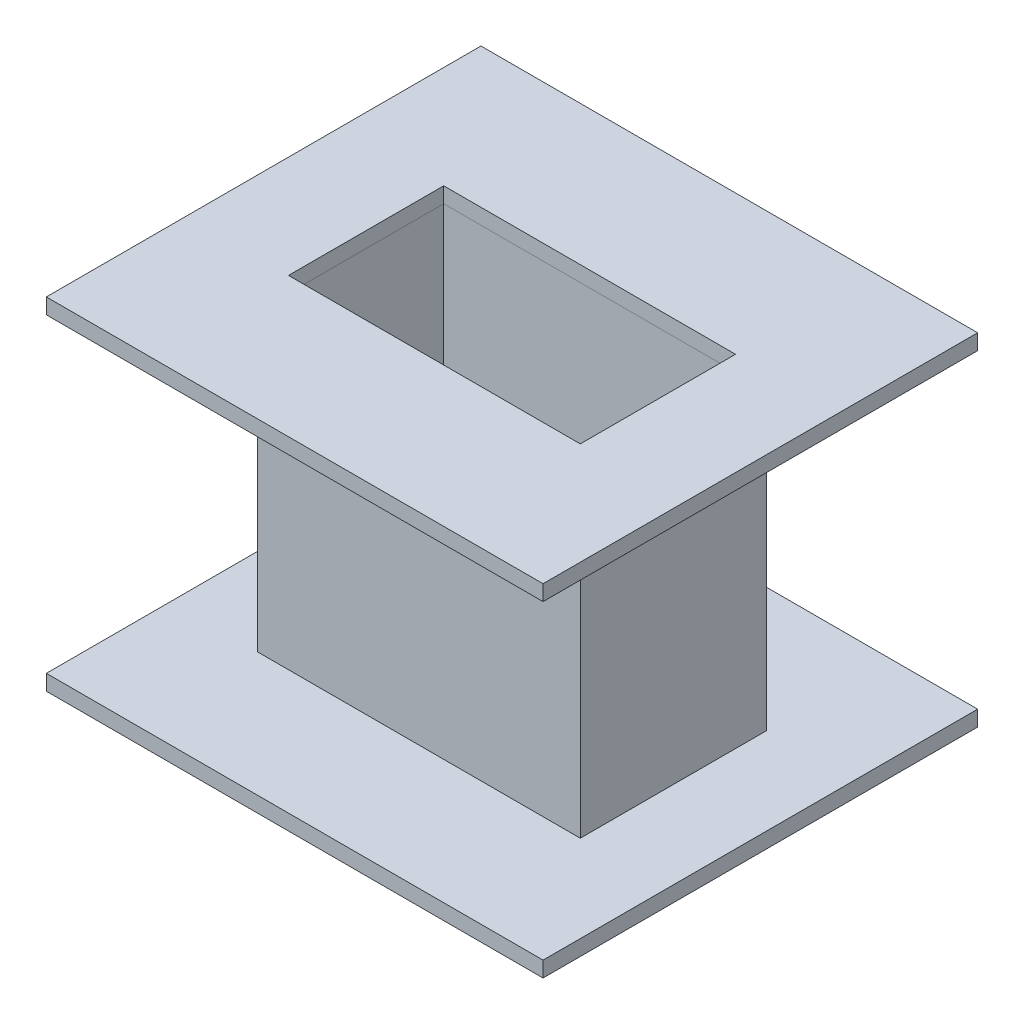
ISO-10303-21;
HEADER;
FILE_DESCRIPTION(('STEP AP214'),'2;1');
FILE_NAME('part.step','',(''),(''),'','','');
FILE_SCHEMA(('AUTOMOTIVE_DESIGN { 1 0 10303 214 1 1 1 1 }'));
ENDSEC;
DATA;
#1=APPLICATION_CONTEXT('core data for automotive mechanical design processes');
#2=APPLICATION_PROTOCOL_DEFINITION('international standard','automotive_design',2000,#1);
#3=PRODUCT_CONTEXT('',#1,'mechanical');
#4=PRODUCT('Part','Part','',(#3));
#5=PRODUCT_RELATED_PRODUCT_CATEGORY('part','',(#4));
#6=PRODUCT_DEFINITION_FORMATION('','',#4);
#7=PRODUCT_DEFINITION_CONTEXT('part definition',#1,'design');
#8=PRODUCT_DEFINITION('design','',#6,#7);
#9=PRODUCT_DEFINITION_SHAPE('','',#8);
#10=(LENGTH_UNIT() NAMED_UNIT(*) SI_UNIT(.MILLI.,.METRE.));
#11=(NAMED_UNIT(*) PLANE_ANGLE_UNIT() SI_UNIT($,.RADIAN.));
#12=(NAMED_UNIT(*) SI_UNIT($,.STERADIAN.) SOLID_ANGLE_UNIT());
#13=UNCERTAINTY_MEASURE_WITH_UNIT(LENGTH_MEASURE(1.E-05),#10,'distance_accuracy_value','');
#14=(GEOMETRIC_REPRESENTATION_CONTEXT(3) GLOBAL_UNCERTAINTY_ASSIGNED_CONTEXT((#13)) GLOBAL_UNIT_ASSIGNED_CONTEXT((#10,
#11,#12)) REPRESENTATION_CONTEXT('',''));
#15=CARTESIAN_POINT('',(0.,0.,0.));
#16=DIRECTION('',(0.,0.,1.));
#17=DIRECTION('',(1.,0.,0.));
#18=AXIS2_PLACEMENT_3D('',#15,#16,#17);
#19=CARTESIAN_POINT('',(40.,27.5,-35.));
#20=DIRECTION('',(-1.,0.,0.));
#21=DIRECTION('',(0.,0.,1.));
#22=AXIS2_PLACEMENT_3D('',#19,#20,#21);
#23=PLANE('',#22);
#24=DIRECTION('',(0.,0.,-1.));
#25=VECTOR('',#24,1.);
#26=CARTESIAN_POINT('',(40.,25.,-35.));
#27=LINE('',#26,#25);
#28=CARTESIAN_POINT('',(40.,25.,35.));
#29=VERTEX_POINT('',#28);
#30=CARTESIAN_POINT('',(40.,25.,-35.));
#31=VERTEX_POINT('',#30);
#32=EDGE_CURVE('E136',#29,#31,#27,.T.);
#33=ORIENTED_EDGE('',*,*,#32,.T.);
#34=DIRECTION('',(0.,-1.,0.));
#35=VECTOR('',#34,1.);
#36=CARTESIAN_POINT('',(40.,27.5,-35.));
#37=LINE('',#36,#35);
#38=CARTESIAN_POINT('',(40.,27.5,-35.));
#39=VERTEX_POINT('',#38);
#40=EDGE_CURVE('E165',#39,#31,#37,.T.);
#41=ORIENTED_EDGE('',*,*,#40,.F.);
#42=DIRECTION('',(0.,0.,-1.));
#43=VECTOR('',#42,1.);
#44=CARTESIAN_POINT('',(40.,27.5,-35.));
#45=LINE('',#44,#43);
#46=CARTESIAN_POINT('',(40.,27.5,35.));
#47=VERTEX_POINT('',#46);
#48=EDGE_CURVE('E139',#47,#39,#45,.T.);
#49=ORIENTED_EDGE('',*,*,#48,.F.);
#50=DIRECTION('',(0.,-1.,0.));
#51=VECTOR('',#50,1.);
#52=CARTESIAN_POINT('',(40.,27.5,35.));
#53=LINE('',#52,#51);
#54=EDGE_CURVE('E149',#47,#29,#53,.T.);
#55=ORIENTED_EDGE('',*,*,#54,.T.);
#56=EDGE_LOOP('',(#33,#41,#49,#55));
#57=FACE_BOUND('',#56,.T.);
#58=ADVANCED_FACE('F46',(#57),#23,.F.);
#59=CARTESIAN_POINT('',(-40.,27.5,-35.));
#60=DIRECTION('',(0.,0.,1.));
#61=DIRECTION('',(1.,0.,0.));
#62=AXIS2_PLACEMENT_3D('',#59,#60,#61);
#63=PLANE('',#62);
#64=DIRECTION('',(-1.,0.,0.));
#65=VECTOR('',#64,1.);
#66=CARTESIAN_POINT('',(-40.,25.,-35.));
#67=LINE('',#66,#65);
#68=CARTESIAN_POINT('',(-40.,25.,-35.));
#69=VERTEX_POINT('',#68);
#70=EDGE_CURVE('E152',#31,#69,#67,.T.);
#71=ORIENTED_EDGE('',*,*,#70,.T.);
#72=DIRECTION('',(0.,-1.,0.));
#73=VECTOR('',#72,1.);
#74=CARTESIAN_POINT('',(-40.,27.5,-35.));
#75=LINE('',#74,#73);
#76=CARTESIAN_POINT('',(-40.,27.5,-35.));
#77=VERTEX_POINT('',#76);
#78=EDGE_CURVE('E162',#77,#69,#75,.T.);
#79=ORIENTED_EDGE('',*,*,#78,.F.);
#80=DIRECTION('',(-1.,0.,0.));
#81=VECTOR('',#80,1.);
#82=CARTESIAN_POINT('',(-40.,27.5,-35.));
#83=LINE('',#82,#81);
#84=EDGE_CURVE('E142',#39,#77,#83,.T.);
#85=ORIENTED_EDGE('',*,*,#84,.F.);
#86=ORIENTED_EDGE('',*,*,#40,.T.);
#87=EDGE_LOOP('',(#71,#79,#85,#86));
#88=FACE_BOUND('',#87,.T.);
#89=ADVANCED_FACE('F189',(#88),#63,.F.);
#90=CARTESIAN_POINT('',(-40.,27.5,-35.));
#91=DIRECTION('',(1.,0.,0.));
#92=DIRECTION('',(0.,0.,-1.));
#93=AXIS2_PLACEMENT_3D('',#90,#91,#92);
#94=PLANE('',#93);
#95=DIRECTION('',(0.,0.,1.));
#96=VECTOR('',#95,1.);
#97=CARTESIAN_POINT('',(-40.,25.,-35.));
#98=LINE('',#97,#96);
#99=CARTESIAN_POINT('',(-40.,25.,35.));
#100=VERTEX_POINT('',#99);
#101=EDGE_CURVE('E154',#69,#100,#98,.T.);
#102=ORIENTED_EDGE('',*,*,#101,.T.);
#103=DIRECTION('',(0.,-1.,0.));
#104=VECTOR('',#103,1.);
#105=CARTESIAN_POINT('',(-40.,27.5,35.));
#106=LINE('',#105,#104);
#107=CARTESIAN_POINT('',(-40.,27.5,35.));
#108=VERTEX_POINT('',#107);
#109=EDGE_CURVE('E159',#108,#100,#106,.T.);
#110=ORIENTED_EDGE('',*,*,#109,.F.);
#111=DIRECTION('',(0.,0.,1.));
#112=VECTOR('',#111,1.);
#113=CARTESIAN_POINT('',(-40.,27.5,-35.));
#114=LINE('',#113,#112);
#115=EDGE_CURVE('E145',#77,#108,#114,.T.);
#116=ORIENTED_EDGE('',*,*,#115,.F.);
#117=ORIENTED_EDGE('',*,*,#78,.T.);
#118=EDGE_LOOP('',(#102,#110,#116,#117));
#119=FACE_BOUND('',#118,.T.);
#120=ADVANCED_FACE('F194',(#119),#94,.F.);
#121=CARTESIAN_POINT('',(-40.,27.5,35.));
#122=DIRECTION('',(0.,0.,-1.));
#123=DIRECTION('',(-1.,0.,0.));
#124=AXIS2_PLACEMENT_3D('',#121,#122,#123);
#125=PLANE('',#124);
#126=DIRECTION('',(1.,0.,0.));
#127=VECTOR('',#126,1.);
#128=CARTESIAN_POINT('',(-40.,25.,35.));
#129=LINE('',#128,#127);
#130=EDGE_CURVE('E143',#100,#29,#129,.T.);
#131=ORIENTED_EDGE('',*,*,#130,.T.);
#132=ORIENTED_EDGE('',*,*,#54,.F.);
#133=DIRECTION('',(1.,0.,0.));
#134=VECTOR('',#133,1.);
#135=CARTESIAN_POINT('',(-40.,27.5,35.));
#136=LINE('',#135,#134);
#137=EDGE_CURVE('E147',#108,#47,#136,.T.);
#138=ORIENTED_EDGE('',*,*,#137,.F.);
#139=ORIENTED_EDGE('',*,*,#109,.T.);
#140=EDGE_LOOP('',(#131,#132,#138,#139));
#141=FACE_BOUND('',#140,.T.);
#142=ADVANCED_FACE('F207',(#141),#125,.F.);
#143=CARTESIAN_POINT('',(0.,27.5,0.));
#144=DIRECTION('',(0.,1.,0.));
#145=DIRECTION('',(0.,0.,1.));
#146=AXIS2_PLACEMENT_3D('',#143,#144,#145);
#147=PLANE('',#146);
#148=DIRECTION('',(0.,0.,1.));
#149=VECTOR('',#148,1.);
#150=CARTESIAN_POINT('',(-23.5,27.5,12.5));
#151=LINE('',#150,#149);
#152=CARTESIAN_POINT('',(-23.5,27.5,-12.5));
#153=VERTEX_POINT('',#152);
#154=CARTESIAN_POINT('',(-23.5,27.5,12.5));
#155=VERTEX_POINT('',#154);
#156=EDGE_CURVE('E60',#153,#155,#151,.T.);
#157=ORIENTED_EDGE('',*,*,#156,.F.);
#158=DIRECTION('',(-1.,0.,0.));
#159=VECTOR('',#158,1.);
#160=CARTESIAN_POINT('',(23.5,27.5,-12.5));
#161=LINE('',#160,#159);
#162=CARTESIAN_POINT('',(23.5,27.5,-12.5));
#163=VERTEX_POINT('',#162);
#164=EDGE_CURVE('E129',#163,#153,#161,.T.);
#165=ORIENTED_EDGE('',*,*,#164,.F.);
#166=DIRECTION('',(0.,0.,-1.));
#167=VECTOR('',#166,1.);
#168=CARTESIAN_POINT('',(23.5,27.5,12.5));
#169=LINE('',#168,#167);
#170=CARTESIAN_POINT('',(23.5,27.5,12.5));
#171=VERTEX_POINT('',#170);
#172=EDGE_CURVE('E113',#171,#163,#169,.T.);
#173=ORIENTED_EDGE('',*,*,#172,.F.);
#174=DIRECTION('',(1.,0.,0.));
#175=VECTOR('',#174,1.);
#176=CARTESIAN_POINT('',(23.5,27.5,12.5));
#177=LINE('',#176,#175);
#178=EDGE_CURVE('E122',#155,#171,#177,.T.);
#179=ORIENTED_EDGE('',*,*,#178,.F.);
#180=EDGE_LOOP('',(#157,#165,#173,#179));
#181=FACE_BOUND('',#180,.T.);
#182=ORIENTED_EDGE('',*,*,#48,.T.);
#183=ORIENTED_EDGE('',*,*,#84,.T.);
#184=ORIENTED_EDGE('',*,*,#115,.T.);
#185=ORIENTED_EDGE('',*,*,#137,.T.);
#186=EDGE_LOOP('',(#182,#183,#184,#185));
#187=FACE_BOUND('',#186,.T.);
#188=ADVANCED_FACE('F126',(#181,#187),#147,.T.);
#189=CARTESIAN_POINT('',(0.,25.,0.));
#190=DIRECTION('',(0.,1.,0.));
#191=DIRECTION('',(0.,0.,1.));
#192=AXIS2_PLACEMENT_3D('',#189,#190,#191);
#193=PLANE('',#192);
#194=DIRECTION('',(-1.,0.,0.));
#195=VECTOR('',#194,1.);
#196=CARTESIAN_POINT('',(0.,25.,-12.5));
#197=LINE('',#196,#195);
#198=CARTESIAN_POINT('',(23.5,25.,-12.5));
#199=VERTEX_POINT('',#198);
#200=CARTESIAN_POINT('',(-23.5,25.,-12.5));
#201=VERTEX_POINT('',#200);
#202=EDGE_CURVE('E53',#199,#201,#197,.T.);
#203=ORIENTED_EDGE('',*,*,#202,.T.);
#204=DIRECTION('',(0.,0.,1.));
#205=VECTOR('',#204,1.);
#206=CARTESIAN_POINT('',(-23.5,25.,0.));
#207=LINE('',#206,#205);
#208=CARTESIAN_POINT('',(-23.5,25.,12.5));
#209=VERTEX_POINT('',#208);
#210=EDGE_CURVE('E12',#201,#209,#207,.T.);
#211=ORIENTED_EDGE('',*,*,#210,.T.);
#212=DIRECTION('',(1.,0.,0.));
#213=VECTOR('',#212,1.);
#214=CARTESIAN_POINT('',(0.,25.,12.5));
#215=LINE('',#214,#213);
#216=CARTESIAN_POINT('',(23.5,25.,12.5));
#217=VERTEX_POINT('',#216);
#218=EDGE_CURVE('E168',#209,#217,#215,.T.);
#219=ORIENTED_EDGE('',*,*,#218,.T.);
#220=DIRECTION('',(0.,0.,-1.));
#221=VECTOR('',#220,1.);
#222=CARTESIAN_POINT('',(23.5,25.,0.));
#223=LINE('',#222,#221);
#224=EDGE_CURVE('E116',#217,#199,#223,.T.);
#225=ORIENTED_EDGE('',*,*,#224,.T.);
#226=EDGE_LOOP('',(#203,#211,#219,#225));
#227=FACE_BOUND('',#226,.T.);
#228=ORIENTED_EDGE('',*,*,#32,.F.);
#229=ORIENTED_EDGE('',*,*,#130,.F.);
#230=ORIENTED_EDGE('',*,*,#101,.F.);
#231=ORIENTED_EDGE('',*,*,#70,.F.);
#232=EDGE_LOOP('',(#228,#229,#230,#231));
#233=FACE_BOUND('',#232,.T.);
#234=ADVANCED_FACE('F172',(#227,#233),#193,.F.);
#235=CARTESIAN_POINT('',(-23.5,-62.5,12.5));
#236=DIRECTION('',(-1.,0.,0.));
#237=DIRECTION('',(0.,0.,1.));
#238=AXIS2_PLACEMENT_3D('',#235,#236,#237);
#239=PLANE('',#238);
#240=DIRECTION('',(0.,1.,0.));
#241=VECTOR('',#240,1.);
#242=CARTESIAN_POINT('',(-23.5,-62.5,-12.5));
#243=LINE('',#242,#241);
#244=EDGE_CURVE('E134',#201,#153,#243,.T.);
#245=ORIENTED_EDGE('',*,*,#244,.T.);
#246=ORIENTED_EDGE('',*,*,#156,.T.);
#247=DIRECTION('',(0.,1.,0.));
#248=VECTOR('',#247,1.);
#249=CARTESIAN_POINT('',(-23.5,-62.5,12.5));
#250=LINE('',#249,#248);
#251=EDGE_CURVE('E119',#209,#155,#250,.T.);
#252=ORIENTED_EDGE('',*,*,#251,.F.);
#253=ORIENTED_EDGE('',*,*,#210,.F.);
#254=EDGE_LOOP('',(#245,#246,#252,#253));
#255=FACE_BOUND('',#254,.T.);
#256=ADVANCED_FACE('F177',(#255),#239,.F.);
#257=CARTESIAN_POINT('',(23.5,-62.5,-12.5));
#258=DIRECTION('',(0.,0.,-1.));
#259=DIRECTION('',(-1.,0.,0.));
#260=AXIS2_PLACEMENT_3D('',#257,#258,#259);
#261=PLANE('',#260);
#262=DIRECTION('',(0.,1.,0.));
#263=VECTOR('',#262,1.);
#264=CARTESIAN_POINT('',(23.5,-62.5,-12.5));
#265=LINE('',#264,#263);
#266=EDGE_CURVE('E118',#199,#163,#265,.T.);
#267=ORIENTED_EDGE('',*,*,#266,.T.);
#268=ORIENTED_EDGE('',*,*,#164,.T.);
#269=ORIENTED_EDGE('',*,*,#244,.F.);
#270=ORIENTED_EDGE('',*,*,#202,.F.);
#271=EDGE_LOOP('',(#267,#268,#269,#270));
#272=FACE_BOUND('',#271,.T.);
#273=ADVANCED_FACE('F176',(#272),#261,.F.);
#274=CARTESIAN_POINT('',(23.5,-62.5,12.5));
#275=DIRECTION('',(1.,0.,0.));
#276=DIRECTION('',(0.,0.,-1.));
#277=AXIS2_PLACEMENT_3D('',#274,#275,#276);
#278=PLANE('',#277);
#279=DIRECTION('',(0.,1.,0.));
#280=VECTOR('',#279,1.);
#281=CARTESIAN_POINT('',(23.5,-62.5,12.5));
#282=LINE('',#281,#280);
#283=EDGE_CURVE('E68',#217,#171,#282,.T.);
#284=ORIENTED_EDGE('',*,*,#283,.T.);
#285=ORIENTED_EDGE('',*,*,#172,.T.);
#286=ORIENTED_EDGE('',*,*,#266,.F.);
#287=ORIENTED_EDGE('',*,*,#224,.F.);
#288=EDGE_LOOP('',(#284,#285,#286,#287));
#289=FACE_BOUND('',#288,.T.);
#290=ADVANCED_FACE('F110',(#289),#278,.F.);
#291=CARTESIAN_POINT('',(23.5,-62.5,12.5));
#292=DIRECTION('',(0.,0.,1.));
#293=DIRECTION('',(1.,0.,0.));
#294=AXIS2_PLACEMENT_3D('',#291,#292,#293);
#295=PLANE('',#294);
#296=ORIENTED_EDGE('',*,*,#251,.T.);
#297=ORIENTED_EDGE('',*,*,#178,.T.);
#298=ORIENTED_EDGE('',*,*,#283,.F.);
#299=ORIENTED_EDGE('',*,*,#218,.F.);
#300=EDGE_LOOP('',(#296,#297,#298,#299));
#301=FACE_BOUND('',#300,.T.);
#302=ADVANCED_FACE('F123',(#301),#295,.F.);
#303=CLOSED_SHELL('',(#58,#89,#120,#142,#188,#234,#256,#273,#290,#302));
#304=MANIFOLD_SOLID_BREP('B2',#303);
#305=CARTESIAN_POINT('',(0.,25.,0.));
#306=DIRECTION('',(0.,-1.,0.));
#307=DIRECTION('',(0.,0.,-1.));
#308=AXIS2_PLACEMENT_3D('',#305,#306,#307);
#309=PLANE('',#308);
#310=DIRECTION('',(-1.,0.,0.));
#311=VECTOR('',#310,1.);
#312=CARTESIAN_POINT('',(-26.,25.,-15.));
#313=LINE('',#312,#311);
#314=CARTESIAN_POINT('',(26.,25.,-15.));
#315=VERTEX_POINT('',#314);
#316=CARTESIAN_POINT('',(-26.,25.,-15.));
#317=VERTEX_POINT('',#316);
#318=EDGE_CURVE('E400',#315,#317,#313,.T.);
#319=ORIENTED_EDGE('',*,*,#318,.T.);
#320=DIRECTION('',(0.,0.,1.));
#321=VECTOR('',#320,1.);
#322=CARTESIAN_POINT('',(-26.,25.,-15.));
#323=LINE('',#322,#321);
#324=CARTESIAN_POINT('',(-26.,25.,15.));
#325=VERTEX_POINT('',#324);
#326=EDGE_CURVE('E414',#317,#325,#323,.T.);
#327=ORIENTED_EDGE('',*,*,#326,.T.);
#328=DIRECTION('',(1.,0.,0.));
#329=VECTOR('',#328,1.);
#330=CARTESIAN_POINT('',(-26.,25.,15.));
#331=LINE('',#330,#329);
#332=CARTESIAN_POINT('',(26.,25.,15.));
#333=VERTEX_POINT('',#332);
#334=EDGE_CURVE('E412',#325,#333,#331,.T.);
#335=ORIENTED_EDGE('',*,*,#334,.T.);
#336=DIRECTION('',(0.,0.,-1.));
#337=VECTOR('',#336,1.);
#338=CARTESIAN_POINT('',(26.,25.,-15.));
#339=LINE('',#338,#337);
#340=EDGE_CURVE('E396',#333,#315,#339,.T.);
#341=ORIENTED_EDGE('',*,*,#340,.T.);
#342=EDGE_LOOP('',(#319,#327,#335,#341));
#343=FACE_BOUND('',#342,.T.);
#344=DIRECTION('',(0.,0.,-1.));
#345=VECTOR('',#344,1.);
#346=CARTESIAN_POINT('',(23.5,25.,-12.5));
#347=LINE('',#346,#345);
#348=CARTESIAN_POINT('',(23.5,25.,12.5));
#349=VERTEX_POINT('',#348);
#350=CARTESIAN_POINT('',(23.5,25.,-12.5));
#351=VERTEX_POINT('',#350);
#352=EDGE_CURVE('E426',#349,#351,#347,.T.);
#353=ORIENTED_EDGE('',*,*,#352,.F.);
#354=DIRECTION('',(1.,0.,0.));
#355=VECTOR('',#354,1.);
#356=CARTESIAN_POINT('',(-23.5,25.,12.5));
#357=LINE('',#356,#355);
#358=CARTESIAN_POINT('',(-23.5,25.,12.5));
#359=VERTEX_POINT('',#358);
#360=EDGE_CURVE('E421',#359,#349,#357,.T.);
#361=ORIENTED_EDGE('',*,*,#360,.F.);
#362=DIRECTION('',(0.,0.,1.));
#363=VECTOR('',#362,1.);
#364=CARTESIAN_POINT('',(-23.5,25.,-12.5));
#365=LINE('',#364,#363);
#366=CARTESIAN_POINT('',(-23.5,25.,-12.5));
#367=VERTEX_POINT('',#366);
#368=EDGE_CURVE('E366',#367,#359,#365,.T.);
#369=ORIENTED_EDGE('',*,*,#368,.F.);
#370=DIRECTION('',(-1.,0.,0.));
#371=VECTOR('',#370,1.);
#372=CARTESIAN_POINT('',(-23.5,25.,-12.5));
#373=LINE('',#372,#371);
#374=EDGE_CURVE('E424',#351,#367,#373,.T.);
#375=ORIENTED_EDGE('',*,*,#374,.F.);
#376=EDGE_LOOP('',(#353,#361,#369,#375));
#377=FACE_BOUND('',#376,.T.);
#378=ADVANCED_FACE('F275',(#343,#377),#309,.F.);
#379=CARTESIAN_POINT('',(-26.,25.,-15.));
#380=DIRECTION('',(0.,0.,1.));
#381=DIRECTION('',(1.,0.,0.));
#382=AXIS2_PLACEMENT_3D('',#379,#380,#381);
#383=PLANE('',#382);
#384=DIRECTION('',(-1.,0.,0.));
#385=VECTOR('',#384,1.);
#386=CARTESIAN_POINT('',(-26.,-25.,-15.));
#387=LINE('',#386,#385);
#388=CARTESIAN_POINT('',(26.,-25.,-15.));
#389=VERTEX_POINT('',#388);
#390=CARTESIAN_POINT('',(-26.,-25.,-15.));
#391=VERTEX_POINT('',#390);
#392=EDGE_CURVE('E407',#389,#391,#387,.T.);
#393=ORIENTED_EDGE('',*,*,#392,.T.);
#394=DIRECTION('',(0.,-1.,0.));
#395=VECTOR('',#394,1.);
#396=CARTESIAN_POINT('',(-26.,25.,-15.));
#397=LINE('',#396,#395);
#398=EDGE_CURVE('E376',#317,#391,#397,.T.);
#399=ORIENTED_EDGE('',*,*,#398,.F.);
#400=ORIENTED_EDGE('',*,*,#318,.F.);
#401=DIRECTION('',(0.,-1.,0.));
#402=VECTOR('',#401,1.);
#403=CARTESIAN_POINT('',(26.,25.,-15.));
#404=LINE('',#403,#402);
#405=EDGE_CURVE('E393',#315,#389,#404,.T.);
#406=ORIENTED_EDGE('',*,*,#405,.T.);
#407=EDGE_LOOP('',(#393,#399,#400,#406));
#408=FACE_BOUND('',#407,.T.);
#409=ADVANCED_FACE('F277',(#408),#383,.F.);
#410=CARTESIAN_POINT('',(-26.,25.,-15.));
#411=DIRECTION('',(1.,0.,0.));
#412=DIRECTION('',(0.,0.,-1.));
#413=AXIS2_PLACEMENT_3D('',#410,#411,#412);
#414=PLANE('',#413);
#415=DIRECTION('',(0.,0.,1.));
#416=VECTOR('',#415,1.);
#417=CARTESIAN_POINT('',(-26.,-25.,-15.));
#418=LINE('',#417,#416);
#419=CARTESIAN_POINT('',(-26.,-25.,15.));
#420=VERTEX_POINT('',#419);
#421=EDGE_CURVE('E404',#391,#420,#418,.T.);
#422=ORIENTED_EDGE('',*,*,#421,.T.);
#423=DIRECTION('',(0.,-1.,0.));
#424=VECTOR('',#423,1.);
#425=CARTESIAN_POINT('',(-26.,25.,15.));
#426=LINE('',#425,#424);
#427=EDGE_CURVE('E387',#325,#420,#426,.T.);
#428=ORIENTED_EDGE('',*,*,#427,.F.);
#429=ORIENTED_EDGE('',*,*,#326,.F.);
#430=ORIENTED_EDGE('',*,*,#398,.T.);
#431=EDGE_LOOP('',(#422,#428,#429,#430));
#432=FACE_BOUND('',#431,.T.);
#433=ADVANCED_FACE('F492',(#432),#414,.F.);
#434=CARTESIAN_POINT('',(-26.,25.,15.));
#435=DIRECTION('',(0.,0.,-1.));
#436=DIRECTION('',(-1.,0.,0.));
#437=AXIS2_PLACEMENT_3D('',#434,#435,#436);
#438=PLANE('',#437);
#439=DIRECTION('',(1.,0.,0.));
#440=VECTOR('',#439,1.);
#441=CARTESIAN_POINT('',(-26.,-25.,15.));
#442=LINE('',#441,#440);
#443=CARTESIAN_POINT('',(26.,-25.,15.));
#444=VERTEX_POINT('',#443);
#445=EDGE_CURVE('E401',#420,#444,#442,.T.);
#446=ORIENTED_EDGE('',*,*,#445,.T.);
#447=DIRECTION('',(0.,-1.,0.));
#448=VECTOR('',#447,1.);
#449=CARTESIAN_POINT('',(26.,25.,15.));
#450=LINE('',#449,#448);
#451=EDGE_CURVE('E390',#333,#444,#450,.T.);
#452=ORIENTED_EDGE('',*,*,#451,.F.);
#453=ORIENTED_EDGE('',*,*,#334,.F.);
#454=ORIENTED_EDGE('',*,*,#427,.T.);
#455=EDGE_LOOP('',(#446,#452,#453,#454));
#456=FACE_BOUND('',#455,.T.);
#457=ADVANCED_FACE('F502',(#456),#438,.F.);
#458=CARTESIAN_POINT('',(26.,25.,-15.));
#459=DIRECTION('',(-1.,0.,0.));
#460=DIRECTION('',(0.,0.,1.));
#461=AXIS2_PLACEMENT_3D('',#458,#459,#460);
#462=PLANE('',#461);
#463=DIRECTION('',(0.,0.,-1.));
#464=VECTOR('',#463,1.);
#465=CARTESIAN_POINT('',(26.,-25.,-15.));
#466=LINE('',#465,#464);
#467=EDGE_CURVE('E397',#444,#389,#466,.T.);
#468=ORIENTED_EDGE('',*,*,#467,.T.);
#469=ORIENTED_EDGE('',*,*,#405,.F.);
#470=ORIENTED_EDGE('',*,*,#340,.F.);
#471=ORIENTED_EDGE('',*,*,#451,.T.);
#472=EDGE_LOOP('',(#468,#469,#470,#471));
#473=FACE_BOUND('',#472,.T.);
#474=ADVANCED_FACE('F499',(#473),#462,.F.);
#475=CARTESIAN_POINT('',(23.5,25.,-12.5));
#476=DIRECTION('',(-1.,0.,0.));
#477=DIRECTION('',(0.,0.,1.));
#478=AXIS2_PLACEMENT_3D('',#475,#476,#477);
#479=PLANE('',#478);
#480=DIRECTION('',(0.,-1.,0.));
#481=VECTOR('',#480,1.);
#482=CARTESIAN_POINT('',(23.5,25.,-12.5));
#483=LINE('',#482,#481);
#484=CARTESIAN_POINT('',(23.5,-27.5,-12.5));
#485=VERTEX_POINT('',#484);
#486=EDGE_CURVE('E410',#351,#485,#483,.T.);
#487=ORIENTED_EDGE('',*,*,#486,.T.);
#488=DIRECTION('',(0.,0.,1.));
#489=VECTOR('',#488,1.);
#490=CARTESIAN_POINT('',(23.5,-27.5,0.));
#491=LINE('',#490,#489);
#492=CARTESIAN_POINT('',(23.5,-27.5,12.5));
#493=VERTEX_POINT('',#492);
#494=EDGE_CURVE('E375',#485,#493,#491,.T.);
#495=ORIENTED_EDGE('',*,*,#494,.T.);
#496=DIRECTION('',(0.,-1.,0.));
#497=VECTOR('',#496,1.);
#498=CARTESIAN_POINT('',(23.5,25.,12.5));
#499=LINE('',#498,#497);
#500=EDGE_CURVE('E290',#349,#493,#499,.T.);
#501=ORIENTED_EDGE('',*,*,#500,.F.);
#502=ORIENTED_EDGE('',*,*,#352,.T.);
#503=EDGE_LOOP('',(#487,#495,#501,#502));
#504=FACE_BOUND('',#503,.T.);
#505=ADVANCED_FACE('F497',(#504),#479,.T.);
#506=CARTESIAN_POINT('',(-23.5,25.,-12.5));
#507=DIRECTION('',(0.,0.,1.));
#508=DIRECTION('',(1.,0.,0.));
#509=AXIS2_PLACEMENT_3D('',#506,#507,#508);
#510=PLANE('',#509);
#511=DIRECTION('',(0.,-1.,0.));
#512=VECTOR('',#511,1.);
#513=CARTESIAN_POINT('',(-23.5,25.,-12.5));
#514=LINE('',#513,#512);
#515=CARTESIAN_POINT('',(-23.5,-27.5,-12.5));
#516=VERTEX_POINT('',#515);
#517=EDGE_CURVE('E368',#367,#516,#514,.T.);
#518=ORIENTED_EDGE('',*,*,#517,.T.);
#519=DIRECTION('',(1.,0.,0.));
#520=VECTOR('',#519,1.);
#521=CARTESIAN_POINT('',(0.,-27.5,-12.5));
#522=LINE('',#521,#520);
#523=EDGE_CURVE('E283',#516,#485,#522,.T.);
#524=ORIENTED_EDGE('',*,*,#523,.T.);
#525=ORIENTED_EDGE('',*,*,#486,.F.);
#526=ORIENTED_EDGE('',*,*,#374,.T.);
#527=EDGE_LOOP('',(#518,#524,#525,#526));
#528=FACE_BOUND('',#527,.T.);
#529=ADVANCED_FACE('F534',(#528),#510,.T.);
#530=CARTESIAN_POINT('',(-23.5,25.,-12.5));
#531=DIRECTION('',(1.,0.,0.));
#532=DIRECTION('',(0.,0.,-1.));
#533=AXIS2_PLACEMENT_3D('',#530,#531,#532);
#534=PLANE('',#533);
#535=DIRECTION('',(0.,-1.,0.));
#536=VECTOR('',#535,1.);
#537=CARTESIAN_POINT('',(-23.5,25.,12.5));
#538=LINE('',#537,#536);
#539=CARTESIAN_POINT('',(-23.5,-27.5,12.5));
#540=VERTEX_POINT('',#539);
#541=EDGE_CURVE('E295',#359,#540,#538,.T.);
#542=ORIENTED_EDGE('',*,*,#541,.T.);
#543=DIRECTION('',(0.,0.,-1.));
#544=VECTOR('',#543,1.);
#545=CARTESIAN_POINT('',(-23.5,-27.5,0.));
#546=LINE('',#545,#544);
#547=EDGE_CURVE('E44',#540,#516,#546,.T.);
#548=ORIENTED_EDGE('',*,*,#547,.T.);
#549=ORIENTED_EDGE('',*,*,#517,.F.);
#550=ORIENTED_EDGE('',*,*,#368,.T.);
#551=EDGE_LOOP('',(#542,#548,#549,#550));
#552=FACE_BOUND('',#551,.T.);
#553=ADVANCED_FACE('F361',(#552),#534,.T.);
#554=CARTESIAN_POINT('',(-23.5,25.,12.5));
#555=DIRECTION('',(0.,0.,-1.));
#556=DIRECTION('',(-1.,0.,0.));
#557=AXIS2_PLACEMENT_3D('',#554,#555,#556);
#558=PLANE('',#557);
#559=ORIENTED_EDGE('',*,*,#500,.T.);
#560=DIRECTION('',(-1.,0.,0.));
#561=VECTOR('',#560,1.);
#562=CARTESIAN_POINT('',(0.,-27.5,12.5));
#563=LINE('',#562,#561);
#564=EDGE_CURVE('E371',#493,#540,#563,.T.);
#565=ORIENTED_EDGE('',*,*,#564,.T.);
#566=ORIENTED_EDGE('',*,*,#541,.F.);
#567=ORIENTED_EDGE('',*,*,#360,.T.);
#568=EDGE_LOOP('',(#559,#565,#566,#567));
#569=FACE_BOUND('',#568,.T.);
#570=ADVANCED_FACE('F372',(#569),#558,.T.);
#571=CARTESIAN_POINT('',(40.,-27.5,-35.));
#572=DIRECTION('',(-1.,0.,0.));
#573=DIRECTION('',(0.,0.,1.));
#574=AXIS2_PLACEMENT_3D('',#571,#572,#573);
#575=PLANE('',#574);
#576=DIRECTION('',(0.,0.,-1.));
#577=VECTOR('',#576,1.);
#578=CARTESIAN_POINT('',(40.,-25.,-35.));
#579=LINE('',#578,#577);
#580=CARTESIAN_POINT('',(40.,-25.,35.));
#581=VERTEX_POINT('',#580);
#582=CARTESIAN_POINT('',(40.,-25.,-35.));
#583=VERTEX_POINT('',#582);
#584=EDGE_CURVE('E459',#581,#583,#579,.T.);
#585=ORIENTED_EDGE('',*,*,#584,.F.);
#586=DIRECTION('',(0.,1.,0.));
#587=VECTOR('',#586,1.);
#588=CARTESIAN_POINT('',(40.,-27.5,35.));
#589=LINE('',#588,#587);
#590=CARTESIAN_POINT('',(40.,-27.5,35.));
#591=VERTEX_POINT('',#590);
#592=EDGE_CURVE('E450',#591,#581,#589,.T.);
#593=ORIENTED_EDGE('',*,*,#592,.F.);
#594=DIRECTION('',(0.,0.,-1.));
#595=VECTOR('',#594,1.);
#596=CARTESIAN_POINT('',(40.,-27.5,-35.));
#597=LINE('',#596,#595);
#598=CARTESIAN_POINT('',(40.,-27.5,-35.));
#599=VERTEX_POINT('',#598);
#600=EDGE_CURVE('E453',#591,#599,#597,.T.);
#601=ORIENTED_EDGE('',*,*,#600,.T.);
#602=DIRECTION('',(0.,1.,0.));
#603=VECTOR('',#602,1.);
#604=CARTESIAN_POINT('',(40.,-27.5,-35.));
#605=LINE('',#604,#603);
#606=EDGE_CURVE('E456',#599,#583,#605,.T.);
#607=ORIENTED_EDGE('',*,*,#606,.T.);
#608=EDGE_LOOP('',(#585,#593,#601,#607));
#609=FACE_BOUND('',#608,.T.);
#610=ADVANCED_FACE('F466',(#609),#575,.F.);
#611=CARTESIAN_POINT('',(-40.,-27.5,-35.));
#612=DIRECTION('',(0.,0.,1.));
#613=DIRECTION('',(1.,0.,0.));
#614=AXIS2_PLACEMENT_3D('',#611,#612,#613);
#615=PLANE('',#614);
#616=DIRECTION('',(-1.,0.,0.));
#617=VECTOR('',#616,1.);
#618=CARTESIAN_POINT('',(-40.,-25.,-35.));
#619=LINE('',#618,#617);
#620=CARTESIAN_POINT('',(-40.,-25.,-35.));
#621=VERTEX_POINT('',#620);
#622=EDGE_CURVE('E447',#583,#621,#619,.T.);
#623=ORIENTED_EDGE('',*,*,#622,.F.);
#624=ORIENTED_EDGE('',*,*,#606,.F.);
#625=DIRECTION('',(-1.,0.,0.));
#626=VECTOR('',#625,1.);
#627=CARTESIAN_POINT('',(-40.,-27.5,-35.));
#628=LINE('',#627,#626);
#629=CARTESIAN_POINT('',(-40.,-27.5,-35.));
#630=VERTEX_POINT('',#629);
#631=EDGE_CURVE('E441',#599,#630,#628,.T.);
#632=ORIENTED_EDGE('',*,*,#631,.T.);
#633=DIRECTION('',(0.,1.,0.));
#634=VECTOR('',#633,1.);
#635=CARTESIAN_POINT('',(-40.,-27.5,-35.));
#636=LINE('',#635,#634);
#637=EDGE_CURVE('E444',#630,#621,#636,.T.);
#638=ORIENTED_EDGE('',*,*,#637,.T.);
#639=EDGE_LOOP('',(#623,#624,#632,#638));
#640=FACE_BOUND('',#639,.T.);
#641=ADVANCED_FACE('F470',(#640),#615,.F.);
#642=CARTESIAN_POINT('',(-40.,-27.5,-35.));
#643=DIRECTION('',(1.,0.,0.));
#644=DIRECTION('',(0.,0.,-1.));
#645=AXIS2_PLACEMENT_3D('',#642,#643,#644);
#646=PLANE('',#645);
#647=DIRECTION('',(0.,0.,1.));
#648=VECTOR('',#647,1.);
#649=CARTESIAN_POINT('',(-40.,-25.,-35.));
#650=LINE('',#649,#648);
#651=CARTESIAN_POINT('',(-40.,-25.,35.));
#652=VERTEX_POINT('',#651);
#653=EDGE_CURVE('E438',#621,#652,#650,.T.);
#654=ORIENTED_EDGE('',*,*,#653,.F.);
#655=ORIENTED_EDGE('',*,*,#637,.F.);
#656=DIRECTION('',(0.,0.,1.));
#657=VECTOR('',#656,1.);
#658=CARTESIAN_POINT('',(-40.,-27.5,-35.));
#659=LINE('',#658,#657);
#660=CARTESIAN_POINT('',(-40.,-27.5,35.));
#661=VERTEX_POINT('',#660);
#662=EDGE_CURVE('E432',#630,#661,#659,.T.);
#663=ORIENTED_EDGE('',*,*,#662,.T.);
#664=DIRECTION('',(0.,1.,0.));
#665=VECTOR('',#664,1.);
#666=CARTESIAN_POINT('',(-40.,-27.5,35.));
#667=LINE('',#666,#665);
#668=EDGE_CURVE('E435',#661,#652,#667,.T.);
#669=ORIENTED_EDGE('',*,*,#668,.T.);
#670=EDGE_LOOP('',(#654,#655,#663,#669));
#671=FACE_BOUND('',#670,.T.);
#672=ADVANCED_FACE('F473',(#671),#646,.F.);
#673=CARTESIAN_POINT('',(-40.,-27.5,35.));
#674=DIRECTION('',(0.,0.,-1.));
#675=DIRECTION('',(-1.,0.,0.));
#676=AXIS2_PLACEMENT_3D('',#673,#674,#675);
#677=PLANE('',#676);
#678=DIRECTION('',(1.,0.,0.));
#679=VECTOR('',#678,1.);
#680=CARTESIAN_POINT('',(-40.,-25.,35.));
#681=LINE('',#680,#679);
#682=EDGE_CURVE('E430',#652,#581,#681,.T.);
#683=ORIENTED_EDGE('',*,*,#682,.F.);
#684=ORIENTED_EDGE('',*,*,#668,.F.);
#685=DIRECTION('',(1.,0.,0.));
#686=VECTOR('',#685,1.);
#687=CARTESIAN_POINT('',(-40.,-27.5,35.));
#688=LINE('',#687,#686);
#689=EDGE_CURVE('E428',#661,#591,#688,.T.);
#690=ORIENTED_EDGE('',*,*,#689,.T.);
#691=ORIENTED_EDGE('',*,*,#592,.T.);
#692=EDGE_LOOP('',(#683,#684,#690,#691));
#693=FACE_BOUND('',#692,.T.);
#694=ADVANCED_FACE('F476',(#693),#677,.F.);
#695=CARTESIAN_POINT('',(0.,-27.5,0.));
#696=DIRECTION('',(0.,-1.,0.));
#697=DIRECTION('',(0.,0.,1.));
#698=AXIS2_PLACEMENT_3D('',#695,#696,#697);
#699=PLANE('',#698);
#700=ORIENTED_EDGE('',*,*,#547,.F.);
#701=ORIENTED_EDGE('',*,*,#564,.F.);
#702=ORIENTED_EDGE('',*,*,#494,.F.);
#703=ORIENTED_EDGE('',*,*,#523,.F.);
#704=EDGE_LOOP('',(#700,#701,#702,#703));
#705=FACE_BOUND('',#704,.T.);
#706=ORIENTED_EDGE('',*,*,#600,.F.);
#707=ORIENTED_EDGE('',*,*,#689,.F.);
#708=ORIENTED_EDGE('',*,*,#662,.F.);
#709=ORIENTED_EDGE('',*,*,#631,.F.);
#710=EDGE_LOOP('',(#706,#707,#708,#709));
#711=FACE_BOUND('',#710,.T.);
#712=ADVANCED_FACE('F378',(#705,#711),#699,.T.);
#713=CARTESIAN_POINT('',(0.,-25.,0.));
#714=DIRECTION('',(0.,-1.,0.));
#715=DIRECTION('',(0.,0.,1.));
#716=AXIS2_PLACEMENT_3D('',#713,#714,#715);
#717=PLANE('',#716);
#718=ORIENTED_EDGE('',*,*,#392,.F.);
#719=ORIENTED_EDGE('',*,*,#467,.F.);
#720=ORIENTED_EDGE('',*,*,#445,.F.);
#721=ORIENTED_EDGE('',*,*,#421,.F.);
#722=EDGE_LOOP('',(#718,#719,#720,#721));
#723=FACE_BOUND('',#722,.T.);
#724=ORIENTED_EDGE('',*,*,#584,.T.);
#725=ORIENTED_EDGE('',*,*,#622,.T.);
#726=ORIENTED_EDGE('',*,*,#653,.T.);
#727=ORIENTED_EDGE('',*,*,#682,.T.);
#728=EDGE_LOOP('',(#724,#725,#726,#727));
#729=FACE_BOUND('',#728,.T.);
#730=ADVANCED_FACE('F463',(#723,#729),#717,.F.);
#731=CLOSED_SHELL('',(#378,#409,#433,#457,#474,#505,#529,#553,#570,#610,#641,#672,#694,#712,#730));
#732=MANIFOLD_SOLID_BREP('B6',#731);
#733=ADVANCED_BREP_SHAPE_REPRESENTATION('',(#18,#304,#732),#14);
#734=SHAPE_DEFINITION_REPRESENTATION(#9,#733);
ENDSEC;
END-ISO-10303-21;
